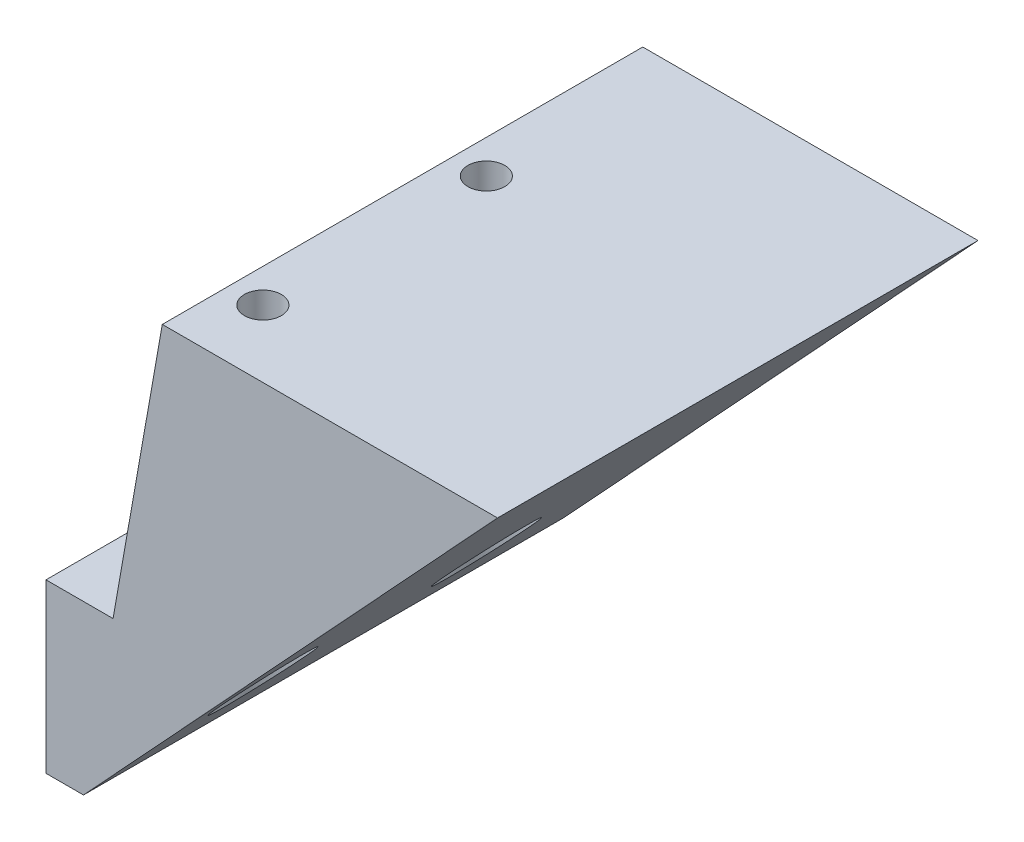
ISO-10303-21;
HEADER;
FILE_DESCRIPTION(('STEP AP214'),'2;1');
FILE_NAME('part.step','',(''),(''),'','','');
FILE_SCHEMA(('AUTOMOTIVE_DESIGN { 1 0 10303 214 1 1 1 1 }'));
ENDSEC;
DATA;
#1=APPLICATION_CONTEXT('core data for automotive mechanical design processes');
#2=APPLICATION_PROTOCOL_DEFINITION('international standard','automotive_design',2000,#1);
#3=PRODUCT_CONTEXT('',#1,'mechanical');
#4=PRODUCT('Part','Part','',(#3));
#5=PRODUCT_RELATED_PRODUCT_CATEGORY('part','',(#4));
#6=PRODUCT_DEFINITION_FORMATION('','',#4);
#7=PRODUCT_DEFINITION_CONTEXT('part definition',#1,'design');
#8=PRODUCT_DEFINITION('design','',#6,#7);
#9=PRODUCT_DEFINITION_SHAPE('','',#8);
#10=(LENGTH_UNIT() NAMED_UNIT(*) SI_UNIT(.MILLI.,.METRE.));
#11=(NAMED_UNIT(*) PLANE_ANGLE_UNIT() SI_UNIT($,.RADIAN.));
#12=(NAMED_UNIT(*) SI_UNIT($,.STERADIAN.) SOLID_ANGLE_UNIT());
#13=UNCERTAINTY_MEASURE_WITH_UNIT(LENGTH_MEASURE(1.E-05),#10,'distance_accuracy_value','');
#14=(GEOMETRIC_REPRESENTATION_CONTEXT(3) GLOBAL_UNCERTAINTY_ASSIGNED_CONTEXT((#13)) GLOBAL_UNIT_ASSIGNED_CONTEXT((#10,
#11,#12)) REPRESENTATION_CONTEXT('',''));
#15=CARTESIAN_POINT('',(0.,0.,0.));
#16=DIRECTION('',(0.,0.,1.));
#17=DIRECTION('',(1.,0.,0.));
#18=AXIS2_PLACEMENT_3D('',#15,#16,#17);
#19=CARTESIAN_POINT('',(10.0530792283384,0.,37.));
#20=DIRECTION('',(0.,1.,0.));
#21=DIRECTION('',(-1.,0.,0.));
#22=AXIS2_PLACEMENT_3D('',#19,#20,#21);
#23=CYLINDRICAL_SURFACE('',#22,1.65);
#24=CARTESIAN_POINT('',(10.0530792283384,40.,37.));
#25=DIRECTION('',(0.,1.,0.));
#26=DIRECTION('',(-1.,0.,0.));
#27=AXIS2_PLACEMENT_3D('',#24,#25,#26);
#28=CIRCLE('',#27,1.65);
#29=CARTESIAN_POINT('',(8.40307922833843,40.,37.));
#30=VERTEX_POINT('',#29);
#31=EDGE_CURVE('E153',#30,#30,#28,.T.);
#32=ORIENTED_EDGE('',*,*,#31,.T.);
#33=EDGE_LOOP('',(#32));
#34=FACE_BOUND('',#33,.T.);
#35=CARTESIAN_POINT('',(10.0530792283384,15.,37.));
#36=DIRECTION('',(0.,-1.,0.));
#37=DIRECTION('',(0.,0.,-1.));
#38=AXIS2_PLACEMENT_3D('',#35,#36,#37);
#39=CIRCLE('',#38,1.65);
#40=CARTESIAN_POINT('',(10.0530792283384,15.,35.35));
#41=VERTEX_POINT('',#40);
#42=EDGE_CURVE('E121',#41,#41,#39,.F.);
#43=ORIENTED_EDGE('',*,*,#42,.F.);
#44=EDGE_LOOP('',(#43));
#45=FACE_BOUND('',#44,.T.);
#46=ADVANCED_FACE('F43',(#34,#45),#23,.F.);
#47=CARTESIAN_POINT('',(10.0530792283384,0.,17.));
#48=DIRECTION('',(0.,1.,0.));
#49=DIRECTION('',(-1.,0.,0.));
#50=AXIS2_PLACEMENT_3D('',#47,#48,#49);
#51=CYLINDRICAL_SURFACE('',#50,1.65);
#52=CARTESIAN_POINT('',(10.0530792283384,40.,17.));
#53=DIRECTION('',(0.,1.,0.));
#54=DIRECTION('',(-1.,0.,0.));
#55=AXIS2_PLACEMENT_3D('',#52,#53,#54);
#56=CIRCLE('',#55,1.65);
#57=CARTESIAN_POINT('',(8.40307922833843,40.,17.));
#58=VERTEX_POINT('',#57);
#59=EDGE_CURVE('E160',#58,#58,#56,.T.);
#60=ORIENTED_EDGE('',*,*,#59,.T.);
#61=EDGE_LOOP('',(#60));
#62=FACE_BOUND('',#61,.T.);
#63=CARTESIAN_POINT('',(10.0530792283384,15.,17.));
#64=DIRECTION('',(0.,-1.,0.));
#65=DIRECTION('',(0.,0.,-1.));
#66=AXIS2_PLACEMENT_3D('',#63,#64,#65);
#67=CIRCLE('',#66,1.65);
#68=CARTESIAN_POINT('',(10.0530792283384,15.,15.35));
#69=VERTEX_POINT('',#68);
#70=EDGE_CURVE('E117',#69,#69,#67,.F.);
#71=ORIENTED_EDGE('',*,*,#70,.F.);
#72=EDGE_LOOP('',(#71));
#73=FACE_BOUND('',#72,.T.);
#74=ADVANCED_FACE('F226',(#62,#73),#51,.F.);
#75=CARTESIAN_POINT('',(37.0530792283384,40.,43.));
#76=DIRECTION('',(-0.733613981813898,0.67956642477918,0.));
#77=DIRECTION('',(-0.67956642477918,-0.733613981813898,0.));
#78=AXIS2_PLACEMENT_3D('',#75,#76,#77);
#79=PLANE('',#78);
#80=CARTESIAN_POINT('',(10.0530792283384,10.8526248697299,37.));
#81=DIRECTION('',(-0.733613981813898,0.67956642477918,0.));
#82=DIRECTION('',(-0.67956642477918,-0.733613981813898,0.));
#83=AXIS2_PLACEMENT_3D('',#80,#81,#82);
#84=ELLIPSE('',#83,5.15034273674909,3.5);
#85=CARTESIAN_POINT('',(6.55307922833842,7.07426142691707,37.));
#86=VERTEX_POINT('',#85);
#87=EDGE_CURVE('E47',#86,#86,#84,.T.);
#88=ORIENTED_EDGE('',*,*,#87,.T.);
#89=EDGE_LOOP('',(#88));
#90=FACE_BOUND('',#89,.T.);
#91=CARTESIAN_POINT('',(10.0530792283384,10.8526248697299,17.));
#92=DIRECTION('',(-0.733613981813898,0.67956642477918,0.));
#93=DIRECTION('',(-0.67956642477918,-0.733613981813898,0.));
#94=AXIS2_PLACEMENT_3D('',#91,#92,#93);
#95=ELLIPSE('',#94,5.15034273674909,3.5);
#96=CARTESIAN_POINT('',(6.55307922833842,7.07426142691707,17.));
#97=VERTEX_POINT('',#96);
#98=EDGE_CURVE('E125',#97,#97,#95,.T.);
#99=ORIENTED_EDGE('',*,*,#98,.T.);
#100=EDGE_LOOP('',(#99));
#101=FACE_BOUND('',#100,.T.);
#102=DIRECTION('',(0.67956642477918,0.733613981813898,0.));
#103=VECTOR('',#102,1.);
#104=CARTESIAN_POINT('',(37.0530792283384,40.,0.));
#105=LINE('',#104,#103);
#106=CARTESIAN_POINT('',(0.,0.,0.));
#107=VERTEX_POINT('',#106);
#108=CARTESIAN_POINT('',(37.0530792283384,40.,0.));
#109=VERTEX_POINT('',#108);
#110=EDGE_CURVE('E92',#107,#109,#105,.T.);
#111=ORIENTED_EDGE('',*,*,#110,.T.);
#112=DIRECTION('',(0.,0.,-1.));
#113=VECTOR('',#112,1.);
#114=CARTESIAN_POINT('',(37.0530792283384,40.,43.));
#115=LINE('',#114,#113);
#116=CARTESIAN_POINT('',(37.0530792283384,40.,43.));
#117=VERTEX_POINT('',#116);
#118=EDGE_CURVE('E11',#117,#109,#115,.T.);
#119=ORIENTED_EDGE('',*,*,#118,.F.);
#120=DIRECTION('',(0.67956642477918,0.733613981813898,0.));
#121=VECTOR('',#120,1.);
#122=CARTESIAN_POINT('',(37.0530792283384,40.,43.));
#123=LINE('',#122,#121);
#124=CARTESIAN_POINT('',(0.,0.,43.));
#125=VERTEX_POINT('',#124);
#126=EDGE_CURVE('E108',#125,#117,#123,.T.);
#127=ORIENTED_EDGE('',*,*,#126,.F.);
#128=DIRECTION('',(0.,0.,-1.));
#129=VECTOR('',#128,1.);
#130=CARTESIAN_POINT('',(0.,0.,43.));
#131=LINE('',#130,#129);
#132=EDGE_CURVE('E100',#125,#107,#131,.T.);
#133=ORIENTED_EDGE('',*,*,#132,.T.);
#134=EDGE_LOOP('',(#111,#119,#127,#133));
#135=FACE_BOUND('',#134,.T.);
#136=ADVANCED_FACE('F45',(#90,#101,#135),#79,.F.);
#137=CARTESIAN_POINT('',(7.05307922833844,40.,43.));
#138=DIRECTION('',(0.,-1.,0.));
#139=DIRECTION('',(1.,0.,0.));
#140=AXIS2_PLACEMENT_3D('',#137,#138,#139);
#141=PLANE('',#140);
#142=ORIENTED_EDGE('',*,*,#59,.F.);
#143=EDGE_LOOP('',(#142));
#144=FACE_BOUND('',#143,.T.);
#145=ORIENTED_EDGE('',*,*,#31,.F.);
#146=EDGE_LOOP('',(#145));
#147=FACE_BOUND('',#146,.T.);
#148=DIRECTION('',(-1.,0.,0.));
#149=VECTOR('',#148,1.);
#150=CARTESIAN_POINT('',(7.05307922833844,40.,0.));
#151=LINE('',#150,#149);
#152=CARTESIAN_POINT('',(7.05307922833844,40.,0.));
#153=VERTEX_POINT('',#152);
#154=EDGE_CURVE('E81',#109,#153,#151,.T.);
#155=ORIENTED_EDGE('',*,*,#154,.T.);
#156=DIRECTION('',(0.,0.,-1.));
#157=VECTOR('',#156,1.);
#158=CARTESIAN_POINT('',(7.05307922833844,40.,43.));
#159=LINE('',#158,#157);
#160=CARTESIAN_POINT('',(7.05307922833844,40.,43.));
#161=VERTEX_POINT('',#160);
#162=EDGE_CURVE('E53',#161,#153,#159,.T.);
#163=ORIENTED_EDGE('',*,*,#162,.F.);
#164=DIRECTION('',(-1.,0.,0.));
#165=VECTOR('',#164,1.);
#166=CARTESIAN_POINT('',(7.05307922833844,40.,43.));
#167=LINE('',#166,#165);
#168=EDGE_CURVE('E70',#117,#161,#167,.T.);
#169=ORIENTED_EDGE('',*,*,#168,.F.);
#170=ORIENTED_EDGE('',*,*,#118,.T.);
#171=EDGE_LOOP('',(#155,#163,#169,#170));
#172=FACE_BOUND('',#171,.T.);
#173=ADVANCED_FACE('F83',(#144,#147,#172),#141,.F.);
#174=CARTESIAN_POINT('',(0.,0.,43.));
#175=DIRECTION('',(0.984807753012209,-0.173648177666926,0.));
#176=DIRECTION('',(0.173648177666927,0.984807753012209,0.));
#177=AXIS2_PLACEMENT_3D('',#174,#175,#176);
#178=PLANE('',#177);
#179=DIRECTION('',(-0.173648177666926,-0.984807753012209,0.));
#180=VECTOR('',#179,1.);
#181=CARTESIAN_POINT('',(0.,0.,0.));
#182=LINE('',#181,#180);
#183=CARTESIAN_POINT('',(2.64490471062691,15.,0.));
#184=VERTEX_POINT('',#183);
#185=EDGE_CURVE('E91',#153,#184,#182,.T.);
#186=ORIENTED_EDGE('',*,*,#185,.T.);
#187=DIRECTION('',(0.,0.,1.));
#188=VECTOR('',#187,1.);
#189=CARTESIAN_POINT('',(2.64490471062691,15.,0.));
#190=LINE('',#189,#188);
#191=CARTESIAN_POINT('',(2.64490471062691,15.,43.));
#192=VERTEX_POINT('',#191);
#193=EDGE_CURVE('E157',#184,#192,#190,.T.);
#194=ORIENTED_EDGE('',*,*,#193,.T.);
#195=DIRECTION('',(-0.173648177666926,-0.984807753012209,0.));
#196=VECTOR('',#195,1.);
#197=CARTESIAN_POINT('',(0.,0.,43.));
#198=LINE('',#197,#196);
#199=EDGE_CURVE('E98',#161,#192,#198,.T.);
#200=ORIENTED_EDGE('',*,*,#199,.F.);
#201=ORIENTED_EDGE('',*,*,#162,.T.);
#202=EDGE_LOOP('',(#186,#194,#200,#201));
#203=FACE_BOUND('',#202,.T.);
#204=ADVANCED_FACE('F96',(#203),#178,.F.);
#205=CARTESIAN_POINT('',(0.,0.,43.));
#206=DIRECTION('',(0.,0.,1.));
#207=DIRECTION('',(1.,0.,0.));
#208=AXIS2_PLACEMENT_3D('',#205,#206,#207);
#209=PLANE('',#208);
#210=ORIENTED_EDGE('',*,*,#126,.T.);
#211=ORIENTED_EDGE('',*,*,#168,.T.);
#212=ORIENTED_EDGE('',*,*,#199,.T.);
#213=DIRECTION('',(-1.,0.,0.));
#214=VECTOR('',#213,1.);
#215=CARTESIAN_POINT('',(2.64490471062691,15.,43.));
#216=LINE('',#215,#214);
#217=CARTESIAN_POINT('',(-3.35509528937309,15.,43.));
#218=VERTEX_POINT('',#217);
#219=EDGE_CURVE('E61',#192,#218,#216,.T.);
#220=ORIENTED_EDGE('',*,*,#219,.T.);
#221=DIRECTION('',(0.,-1.,0.));
#222=VECTOR('',#221,1.);
#223=CARTESIAN_POINT('',(-3.35509528937309,15.,43.));
#224=LINE('',#223,#222);
#225=CARTESIAN_POINT('',(-3.35509528937308,0.,43.));
#226=VERTEX_POINT('',#225);
#227=EDGE_CURVE('E135',#218,#226,#224,.T.);
#228=ORIENTED_EDGE('',*,*,#227,.T.);
#229=DIRECTION('',(1.,0.,0.));
#230=VECTOR('',#229,1.);
#231=CARTESIAN_POINT('',(-3.35509528937308,0.,43.));
#232=LINE('',#231,#230);
#233=EDGE_CURVE('E140',#226,#125,#232,.T.);
#234=ORIENTED_EDGE('',*,*,#233,.T.);
#235=EDGE_LOOP('',(#210,#211,#212,#220,#228,#234));
#236=FACE_BOUND('',#235,.T.);
#237=ADVANCED_FACE('F237',(#236),#209,.T.);
#238=CARTESIAN_POINT('',(0.,0.,0.));
#239=DIRECTION('',(0.,0.,1.));
#240=DIRECTION('',(1.,0.,0.));
#241=AXIS2_PLACEMENT_3D('',#238,#239,#240);
#242=PLANE('',#241);
#243=ORIENTED_EDGE('',*,*,#110,.F.);
#244=DIRECTION('',(1.,0.,0.));
#245=VECTOR('',#244,1.);
#246=CARTESIAN_POINT('',(-3.35509528937308,0.,0.));
#247=LINE('',#246,#245);
#248=CARTESIAN_POINT('',(-3.35509528937308,0.,0.));
#249=VERTEX_POINT('',#248);
#250=EDGE_CURVE('E143',#249,#107,#247,.T.);
#251=ORIENTED_EDGE('',*,*,#250,.F.);
#252=DIRECTION('',(0.,-1.,0.));
#253=VECTOR('',#252,1.);
#254=CARTESIAN_POINT('',(-3.35509528937309,15.,0.));
#255=LINE('',#254,#253);
#256=CARTESIAN_POINT('',(-3.35509528937309,15.,0.));
#257=VERTEX_POINT('',#256);
#258=EDGE_CURVE('E194',#257,#249,#255,.T.);
#259=ORIENTED_EDGE('',*,*,#258,.F.);
#260=DIRECTION('',(-1.,0.,0.));
#261=VECTOR('',#260,1.);
#262=CARTESIAN_POINT('',(2.64490471062691,15.,0.));
#263=LINE('',#262,#261);
#264=EDGE_CURVE('E106',#184,#257,#263,.T.);
#265=ORIENTED_EDGE('',*,*,#264,.F.);
#266=ORIENTED_EDGE('',*,*,#185,.F.);
#267=ORIENTED_EDGE('',*,*,#154,.F.);
#268=EDGE_LOOP('',(#243,#251,#259,#265,#266,#267));
#269=FACE_BOUND('',#268,.T.);
#270=ADVANCED_FACE('F103',(#269),#242,.F.);
#271=CARTESIAN_POINT('',(-3.35509528937308,0.,0.));
#272=DIRECTION('',(0.,-1.,0.));
#273=DIRECTION('',(0.,0.,-1.));
#274=AXIS2_PLACEMENT_3D('',#271,#272,#273);
#275=PLANE('',#274);
#276=ORIENTED_EDGE('',*,*,#233,.F.);
#277=DIRECTION('',(0.,0.,1.));
#278=VECTOR('',#277,1.);
#279=CARTESIAN_POINT('',(-3.35509528937308,0.,0.));
#280=LINE('',#279,#278);
#281=EDGE_CURVE('E149',#249,#226,#280,.T.);
#282=ORIENTED_EDGE('',*,*,#281,.F.);
#283=ORIENTED_EDGE('',*,*,#250,.T.);
#284=ORIENTED_EDGE('',*,*,#132,.F.);
#285=EDGE_LOOP('',(#276,#282,#283,#284));
#286=FACE_BOUND('',#285,.T.);
#287=ADVANCED_FACE('F242',(#286),#275,.T.);
#288=CARTESIAN_POINT('',(-3.35509528937309,15.,0.));
#289=DIRECTION('',(-1.,0.,0.));
#290=DIRECTION('',(0.,-1.,0.));
#291=AXIS2_PLACEMENT_3D('',#288,#289,#290);
#292=PLANE('',#291);
#293=ORIENTED_EDGE('',*,*,#227,.F.);
#294=DIRECTION('',(0.,0.,1.));
#295=VECTOR('',#294,1.);
#296=CARTESIAN_POINT('',(-3.35509528937309,15.,0.));
#297=LINE('',#296,#295);
#298=EDGE_CURVE('E154',#257,#218,#297,.T.);
#299=ORIENTED_EDGE('',*,*,#298,.F.);
#300=ORIENTED_EDGE('',*,*,#258,.T.);
#301=ORIENTED_EDGE('',*,*,#281,.T.);
#302=EDGE_LOOP('',(#293,#299,#300,#301));
#303=FACE_BOUND('',#302,.T.);
#304=ADVANCED_FACE('F193',(#303),#292,.T.);
#305=CARTESIAN_POINT('',(2.64490471062691,15.,0.));
#306=DIRECTION('',(0.,1.,0.));
#307=DIRECTION('',(0.,0.,1.));
#308=AXIS2_PLACEMENT_3D('',#305,#306,#307);
#309=PLANE('',#308);
#310=ORIENTED_EDGE('',*,*,#219,.F.);
#311=ORIENTED_EDGE('',*,*,#193,.F.);
#312=ORIENTED_EDGE('',*,*,#264,.T.);
#313=ORIENTED_EDGE('',*,*,#298,.T.);
#314=EDGE_LOOP('',(#310,#311,#312,#313));
#315=FACE_BOUND('',#314,.T.);
#316=ADVANCED_FACE('F196',(#315),#309,.T.);
#317=CARTESIAN_POINT('',(10.0530792283384,15.,17.));
#318=DIRECTION('',(0.,-1.,0.));
#319=DIRECTION('',(0.,0.,-1.));
#320=AXIS2_PLACEMENT_3D('',#317,#318,#319);
#321=CYLINDRICAL_SURFACE('',#320,3.5);
#322=CARTESIAN_POINT('',(10.0530792283384,15.,17.));
#323=DIRECTION('',(0.,-1.,0.));
#324=DIRECTION('',(0.,0.,-1.));
#325=AXIS2_PLACEMENT_3D('',#322,#323,#324);
#326=CIRCLE('',#325,3.5);
#327=CARTESIAN_POINT('',(10.0530792283384,15.,13.5));
#328=VERTEX_POINT('',#327);
#329=EDGE_CURVE('E200',#328,#328,#326,.T.);
#330=ORIENTED_EDGE('',*,*,#329,.F.);
#331=EDGE_LOOP('',(#330));
#332=FACE_BOUND('',#331,.T.);
#333=ORIENTED_EDGE('',*,*,#98,.F.);
#334=EDGE_LOOP('',(#333));
#335=FACE_BOUND('',#334,.T.);
#336=ADVANCED_FACE('F221',(#332,#335),#321,.F.);
#337=CARTESIAN_POINT('',(10.0530792283384,15.,17.));
#338=DIRECTION('',(0.,-1.,0.));
#339=DIRECTION('',(0.,0.,-1.));
#340=AXIS2_PLACEMENT_3D('',#337,#338,#339);
#341=PLANE('',#340);
#342=ORIENTED_EDGE('',*,*,#329,.T.);
#343=EDGE_LOOP('',(#342));
#344=FACE_BOUND('',#343,.T.);
#345=ORIENTED_EDGE('',*,*,#70,.T.);
#346=EDGE_LOOP('',(#345));
#347=FACE_BOUND('',#346,.T.);
#348=ADVANCED_FACE('F214',(#344,#347),#341,.T.);
#349=CARTESIAN_POINT('',(10.0530792283384,15.,37.));
#350=DIRECTION('',(0.,-1.,0.));
#351=DIRECTION('',(0.,0.,-1.));
#352=AXIS2_PLACEMENT_3D('',#349,#350,#351);
#353=CYLINDRICAL_SURFACE('',#352,3.5);
#354=CARTESIAN_POINT('',(10.0530792283384,15.,37.));
#355=DIRECTION('',(0.,-1.,0.));
#356=DIRECTION('',(0.,0.,-1.));
#357=AXIS2_PLACEMENT_3D('',#354,#355,#356);
#358=CIRCLE('',#357,3.5);
#359=CARTESIAN_POINT('',(10.0530792283384,15.,33.5));
#360=VERTEX_POINT('',#359);
#361=EDGE_CURVE('E122',#360,#360,#358,.T.);
#362=ORIENTED_EDGE('',*,*,#361,.F.);
#363=EDGE_LOOP('',(#362));
#364=FACE_BOUND('',#363,.T.);
#365=ORIENTED_EDGE('',*,*,#87,.F.);
#366=EDGE_LOOP('',(#365));
#367=FACE_BOUND('',#366,.T.);
#368=ADVANCED_FACE('F211',(#364,#367),#353,.F.);
#369=CARTESIAN_POINT('',(10.0530792283384,15.,37.));
#370=DIRECTION('',(0.,-1.,0.));
#371=DIRECTION('',(0.,0.,-1.));
#372=AXIS2_PLACEMENT_3D('',#369,#370,#371);
#373=PLANE('',#372);
#374=ORIENTED_EDGE('',*,*,#361,.T.);
#375=EDGE_LOOP('',(#374));
#376=FACE_BOUND('',#375,.T.);
#377=ORIENTED_EDGE('',*,*,#42,.T.);
#378=EDGE_LOOP('',(#377));
#379=FACE_BOUND('',#378,.T.);
#380=ADVANCED_FACE('F208',(#376,#379),#373,.T.);
#381=CLOSED_SHELL('',(#46,#74,#136,#173,#204,#237,#270,#287,#304,#316,#336,#348,#368,#380));
#382=MANIFOLD_SOLID_BREP('B2',#381);
#383=ADVANCED_BREP_SHAPE_REPRESENTATION('',(#18,#382),#14);
#384=SHAPE_DEFINITION_REPRESENTATION(#9,#383);
ENDSEC;
END-ISO-10303-21;
